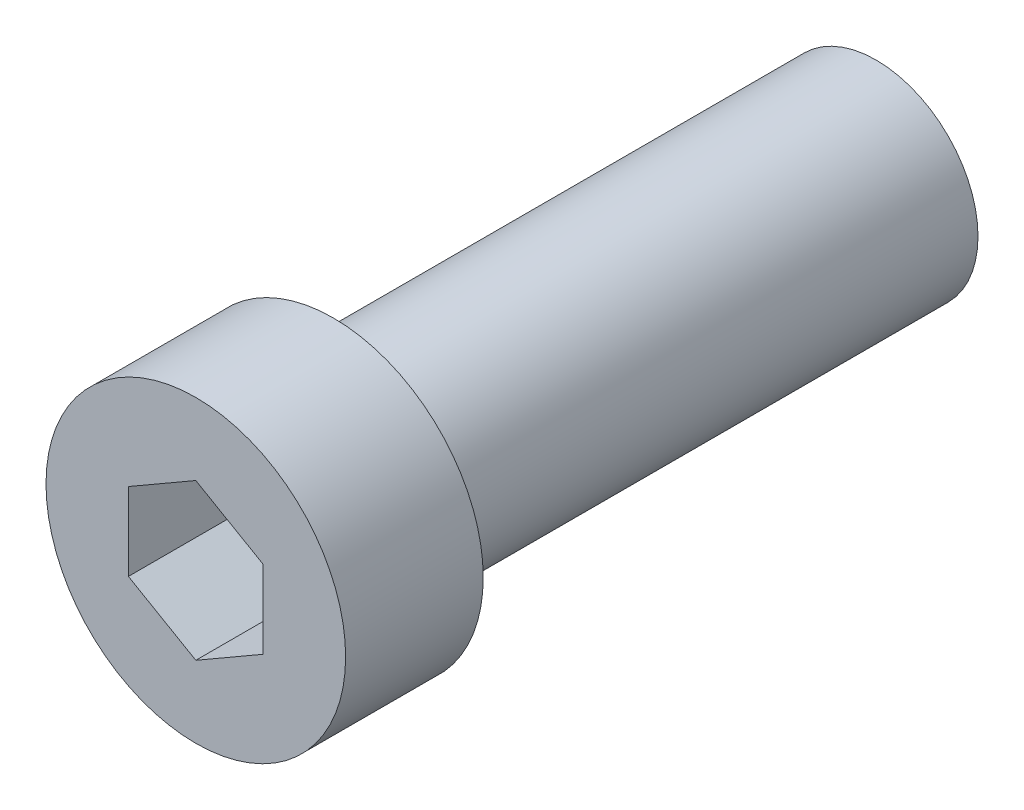
ISO-10303-21;
HEADER;
FILE_DESCRIPTION(('STEP AP214'),'2;1');
FILE_NAME('part.step','',(''),(''),'','','');
FILE_SCHEMA(('AUTOMOTIVE_DESIGN { 1 0 10303 214 1 1 1 1 }'));
ENDSEC;
DATA;
#1=APPLICATION_CONTEXT('core data for automotive mechanical design processes');
#2=APPLICATION_PROTOCOL_DEFINITION('international standard','automotive_design',2000,#1);
#3=PRODUCT_CONTEXT('',#1,'mechanical');
#4=PRODUCT('Part','Part','',(#3));
#5=PRODUCT_RELATED_PRODUCT_CATEGORY('part','',(#4));
#6=PRODUCT_DEFINITION_FORMATION('','',#4);
#7=PRODUCT_DEFINITION_CONTEXT('part definition',#1,'design');
#8=PRODUCT_DEFINITION('design','',#6,#7);
#9=PRODUCT_DEFINITION_SHAPE('','',#8);
#10=(LENGTH_UNIT() NAMED_UNIT(*) SI_UNIT(.MILLI.,.METRE.));
#11=(NAMED_UNIT(*) PLANE_ANGLE_UNIT() SI_UNIT($,.RADIAN.));
#12=(NAMED_UNIT(*) SI_UNIT($,.STERADIAN.) SOLID_ANGLE_UNIT());
#13=UNCERTAINTY_MEASURE_WITH_UNIT(LENGTH_MEASURE(1.E-05),#10,'distance_accuracy_value','');
#14=(GEOMETRIC_REPRESENTATION_CONTEXT(3) GLOBAL_UNCERTAINTY_ASSIGNED_CONTEXT((#13)) GLOBAL_UNIT_ASSIGNED_CONTEXT((#10,
#11,#12)) REPRESENTATION_CONTEXT('',''));
#15=CARTESIAN_POINT('',(0.,0.,0.));
#16=DIRECTION('',(0.,0.,1.));
#17=DIRECTION('',(1.,0.,0.));
#18=AXIS2_PLACEMENT_3D('',#15,#16,#17);
#19=CARTESIAN_POINT('',(0.,0.,2.028));
#20=DIRECTION('',(0.,0.,-1.));
#21=DIRECTION('',(0.,1.,0.));
#22=AXIS2_PLACEMENT_3D('',#19,#20,#21);
#23=CYLINDRICAL_SURFACE('',#22,2.208);
#24=CARTESIAN_POINT('',(0.,0.,2.028));
#25=DIRECTION('',(0.,0.,-1.));
#26=DIRECTION('',(0.,1.,0.));
#27=AXIS2_PLACEMENT_3D('',#24,#25,#26);
#28=CIRCLE('',#27,2.208);
#29=CARTESIAN_POINT('',(0.,2.208,2.028));
#30=VERTEX_POINT('',#29);
#31=EDGE_CURVE('E39',#30,#30,#28,.T.);
#32=ORIENTED_EDGE('',*,*,#31,.T.);
#33=EDGE_LOOP('',(#32));
#34=FACE_BOUND('',#33,.T.);
#35=CARTESIAN_POINT('',(0.,0.,0.));
#36=DIRECTION('',(0.,0.,-1.));
#37=DIRECTION('',(0.,1.,0.));
#38=AXIS2_PLACEMENT_3D('',#35,#36,#37);
#39=CIRCLE('',#38,2.208);
#40=CARTESIAN_POINT('',(0.,2.208,0.));
#41=VERTEX_POINT('',#40);
#42=EDGE_CURVE('E145',#41,#41,#39,.T.);
#43=ORIENTED_EDGE('',*,*,#42,.F.);
#44=EDGE_LOOP('',(#43));
#45=FACE_BOUND('',#44,.T.);
#46=ADVANCED_FACE('F36',(#34,#45),#23,.T.);
#47=CARTESIAN_POINT('',(2.208,0.,2.028));
#48=DIRECTION('',(0.,0.,1.));
#49=DIRECTION('',(0.,-1.,0.));
#50=AXIS2_PLACEMENT_3D('',#47,#48,#49);
#51=PLANE('',#50);
#52=DIRECTION('',(0.866025403784439,0.5,0.));
#53=VECTOR('',#52,1.);
#54=CARTESIAN_POINT('',(0.,-1.14731045493362,2.028));
#55=LINE('',#54,#53);
#56=CARTESIAN_POINT('',(0.,-1.14731045493362,2.028));
#57=VERTEX_POINT('',#56);
#58=CARTESIAN_POINT('',(0.9936,-0.573655227466812,2.028));
#59=VERTEX_POINT('',#58);
#60=EDGE_CURVE('E51',#57,#59,#55,.T.);
#61=ORIENTED_EDGE('',*,*,#60,.F.);
#62=DIRECTION('',(0.866025403784439,-0.5,0.));
#63=VECTOR('',#62,1.);
#64=CARTESIAN_POINT('',(-0.9936,-0.573655227466812,2.028));
#65=LINE('',#64,#63);
#66=CARTESIAN_POINT('',(-0.9936,-0.573655227466812,2.028));
#67=VERTEX_POINT('',#66);
#68=EDGE_CURVE('E134',#67,#57,#65,.T.);
#69=ORIENTED_EDGE('',*,*,#68,.F.);
#70=DIRECTION('',(0.,-1.,0.));
#71=VECTOR('',#70,1.);
#72=CARTESIAN_POINT('',(-0.9936,0.573655227466811,2.028));
#73=LINE('',#72,#71);
#74=CARTESIAN_POINT('',(-0.9936,0.573655227466811,2.028));
#75=VERTEX_POINT('',#74);
#76=EDGE_CURVE('E132',#75,#67,#73,.T.);
#77=ORIENTED_EDGE('',*,*,#76,.F.);
#78=DIRECTION('',(-0.866025403784438,-0.500000000000001,0.));
#79=VECTOR('',#78,1.);
#80=CARTESIAN_POINT('',(0.,1.14731045493362,2.028));
#81=LINE('',#80,#79);
#82=CARTESIAN_POINT('',(0.,1.14731045493362,2.028));
#83=VERTEX_POINT('',#82);
#84=EDGE_CURVE('E99',#83,#75,#81,.T.);
#85=ORIENTED_EDGE('',*,*,#84,.F.);
#86=DIRECTION('',(-0.866025403784438,0.500000000000001,0.));
#87=VECTOR('',#86,1.);
#88=CARTESIAN_POINT('',(0.9936,0.573655227466811,2.028));
#89=LINE('',#88,#87);
#90=CARTESIAN_POINT('',(0.9936,0.573655227466811,2.028));
#91=VERTEX_POINT('',#90);
#92=EDGE_CURVE('E128',#91,#83,#89,.T.);
#93=ORIENTED_EDGE('',*,*,#92,.F.);
#94=DIRECTION('',(0.,1.,0.));
#95=VECTOR('',#94,1.);
#96=CARTESIAN_POINT('',(0.9936,-0.573655227466812,2.028));
#97=LINE('',#96,#95);
#98=EDGE_CURVE('E125',#59,#91,#97,.T.);
#99=ORIENTED_EDGE('',*,*,#98,.F.);
#100=EDGE_LOOP('',(#61,#69,#77,#85,#93,#99));
#101=FACE_BOUND('',#100,.T.);
#102=ORIENTED_EDGE('',*,*,#31,.F.);
#103=EDGE_LOOP('',(#102));
#104=FACE_BOUND('',#103,.T.);
#105=ADVANCED_FACE('F154',(#101,#104),#51,.T.);
#106=CARTESIAN_POINT('',(0.,0.,0.));
#107=DIRECTION('',(0.,0.,-1.));
#108=DIRECTION('',(0.,1.,0.));
#109=AXIS2_PLACEMENT_3D('',#106,#107,#108);
#110=PLANE('',#109);
#111=CARTESIAN_POINT('',(0.,0.,0.));
#112=DIRECTION('',(0.,0.,-1.));
#113=DIRECTION('',(0.,1.,0.));
#114=AXIS2_PLACEMENT_3D('',#111,#112,#113);
#115=CIRCLE('',#114,1.50000000000006);
#116=CARTESIAN_POINT('',(0.,1.50000000000006,0.));
#117=VERTEX_POINT('',#116);
#118=EDGE_CURVE('E11',#117,#117,#115,.T.);
#119=ORIENTED_EDGE('',*,*,#118,.F.);
#120=EDGE_LOOP('',(#119));
#121=FACE_BOUND('',#120,.T.);
#122=ORIENTED_EDGE('',*,*,#42,.T.);
#123=EDGE_LOOP('',(#122));
#124=FACE_BOUND('',#123,.T.);
#125=ADVANCED_FACE('F156',(#121,#124),#110,.T.);
#126=CARTESIAN_POINT('',(0.,0.,-8.));
#127=DIRECTION('',(0.,0.,1.));
#128=DIRECTION('',(0.,-1.,0.));
#129=AXIS2_PLACEMENT_3D('',#126,#127,#128);
#130=CYLINDRICAL_SURFACE('',#129,1.50000000000006);
#131=CARTESIAN_POINT('',(0.,0.,-8.));
#132=DIRECTION('',(0.,0.,-1.));
#133=DIRECTION('',(0.,1.,0.));
#134=AXIS2_PLACEMENT_3D('',#131,#132,#133);
#135=CIRCLE('',#134,1.50000000000006);
#136=CARTESIAN_POINT('',(0.,1.50000000000005,-8.));
#137=VERTEX_POINT('',#136);
#138=EDGE_CURVE('E138',#137,#137,#135,.T.);
#139=ORIENTED_EDGE('',*,*,#138,.F.);
#140=EDGE_LOOP('',(#139));
#141=FACE_BOUND('',#140,.T.);
#142=ORIENTED_EDGE('',*,*,#118,.T.);
#143=EDGE_LOOP('',(#142));
#144=FACE_BOUND('',#143,.T.);
#145=ADVANCED_FACE('F162',(#141,#144),#130,.T.);
#146=CARTESIAN_POINT('',(0.,0.,-8.));
#147=DIRECTION('',(0.,0.,-1.));
#148=DIRECTION('',(0.,1.,0.));
#149=AXIS2_PLACEMENT_3D('',#146,#147,#148);
#150=PLANE('',#149);
#151=ORIENTED_EDGE('',*,*,#138,.T.);
#152=EDGE_LOOP('',(#151));
#153=FACE_BOUND('',#152,.T.);
#154=ADVANCED_FACE('F168',(#153),#150,.T.);
#155=CARTESIAN_POINT('',(0.,-1.14731045493362,0.156));
#156=DIRECTION('',(0.5,-0.866025403784439,0.));
#157=DIRECTION('',(0.866025403784439,0.5,0.));
#158=AXIS2_PLACEMENT_3D('',#155,#156,#157);
#159=PLANE('',#158);
#160=ORIENTED_EDGE('',*,*,#60,.T.);
#161=DIRECTION('',(0.,0.,1.));
#162=VECTOR('',#161,1.);
#163=CARTESIAN_POINT('',(0.9936,-0.573655227466812,0.156));
#164=LINE('',#163,#162);
#165=CARTESIAN_POINT('',(0.9936,-0.573655227466812,0.156));
#166=VERTEX_POINT('',#165);
#167=EDGE_CURVE('E81',#166,#59,#164,.T.);
#168=ORIENTED_EDGE('',*,*,#167,.F.);
#169=DIRECTION('',(0.866025403784439,0.5,0.));
#170=VECTOR('',#169,1.);
#171=CARTESIAN_POINT('',(0.,-1.14731045493362,0.156));
#172=LINE('',#171,#170);
#173=CARTESIAN_POINT('',(0.,-1.14731045493362,0.156));
#174=VERTEX_POINT('',#173);
#175=EDGE_CURVE('E136',#174,#166,#172,.T.);
#176=ORIENTED_EDGE('',*,*,#175,.F.);
#177=DIRECTION('',(0.,0.,1.));
#178=VECTOR('',#177,1.);
#179=CARTESIAN_POINT('',(0.,-1.14731045493362,0.156));
#180=LINE('',#179,#178);
#181=EDGE_CURVE('E59',#174,#57,#180,.T.);
#182=ORIENTED_EDGE('',*,*,#181,.T.);
#183=EDGE_LOOP('',(#160,#168,#176,#182));
#184=FACE_BOUND('',#183,.T.);
#185=ADVANCED_FACE('F172',(#184),#159,.F.);
#186=CARTESIAN_POINT('',(-0.9936,-0.573655227466812,0.156));
#187=DIRECTION('',(-0.5,-0.866025403784439,0.));
#188=DIRECTION('',(0.866025403784439,-0.5,0.));
#189=AXIS2_PLACEMENT_3D('',#186,#187,#188);
#190=PLANE('',#189);
#191=ORIENTED_EDGE('',*,*,#68,.T.);
#192=ORIENTED_EDGE('',*,*,#181,.F.);
#193=DIRECTION('',(0.866025403784439,-0.5,0.));
#194=VECTOR('',#193,1.);
#195=CARTESIAN_POINT('',(-0.9936,-0.573655227466812,0.156));
#196=LINE('',#195,#194);
#197=CARTESIAN_POINT('',(-0.9936,-0.573655227466812,0.156));
#198=VERTEX_POINT('',#197);
#199=EDGE_CURVE('E111',#198,#174,#196,.T.);
#200=ORIENTED_EDGE('',*,*,#199,.F.);
#201=DIRECTION('',(0.,0.,1.));
#202=VECTOR('',#201,1.);
#203=CARTESIAN_POINT('',(-0.9936,-0.573655227466812,0.156));
#204=LINE('',#203,#202);
#205=EDGE_CURVE('E103',#198,#67,#204,.T.);
#206=ORIENTED_EDGE('',*,*,#205,.T.);
#207=EDGE_LOOP('',(#191,#192,#200,#206));
#208=FACE_BOUND('',#207,.T.);
#209=ADVANCED_FACE('F176',(#208),#190,.F.);
#210=CARTESIAN_POINT('',(-0.9936,0.573655227466811,0.156));
#211=DIRECTION('',(-1.,0.,0.));
#212=DIRECTION('',(0.,0.,1.));
#213=AXIS2_PLACEMENT_3D('',#210,#211,#212);
#214=PLANE('',#213);
#215=ORIENTED_EDGE('',*,*,#76,.T.);
#216=ORIENTED_EDGE('',*,*,#205,.F.);
#217=DIRECTION('',(0.,-1.,0.));
#218=VECTOR('',#217,1.);
#219=CARTESIAN_POINT('',(-0.9936,0.573655227466811,0.156));
#220=LINE('',#219,#218);
#221=CARTESIAN_POINT('',(-0.9936,0.573655227466811,0.156));
#222=VERTEX_POINT('',#221);
#223=EDGE_CURVE('E107',#222,#198,#220,.T.);
#224=ORIENTED_EDGE('',*,*,#223,.F.);
#225=DIRECTION('',(0.,0.,1.));
#226=VECTOR('',#225,1.);
#227=CARTESIAN_POINT('',(-0.9936,0.573655227466811,0.156));
#228=LINE('',#227,#226);
#229=EDGE_CURVE('E92',#222,#75,#228,.T.);
#230=ORIENTED_EDGE('',*,*,#229,.T.);
#231=EDGE_LOOP('',(#215,#216,#224,#230));
#232=FACE_BOUND('',#231,.T.);
#233=ADVANCED_FACE('F108',(#232),#214,.F.);
#234=CARTESIAN_POINT('',(0.,1.14731045493362,0.156));
#235=DIRECTION('',(-0.500000000000001,0.866025403784438,0.));
#236=DIRECTION('',(-0.866025403784438,-0.500000000000001,0.));
#237=AXIS2_PLACEMENT_3D('',#234,#235,#236);
#238=PLANE('',#237);
#239=ORIENTED_EDGE('',*,*,#84,.T.);
#240=ORIENTED_EDGE('',*,*,#229,.F.);
#241=DIRECTION('',(-0.866025403784438,-0.500000000000001,0.));
#242=VECTOR('',#241,1.);
#243=CARTESIAN_POINT('',(0.,1.14731045493362,0.156));
#244=LINE('',#243,#242);
#245=CARTESIAN_POINT('',(0.,1.14731045493362,0.156));
#246=VERTEX_POINT('',#245);
#247=EDGE_CURVE('E96',#246,#222,#244,.T.);
#248=ORIENTED_EDGE('',*,*,#247,.F.);
#249=DIRECTION('',(0.,0.,1.));
#250=VECTOR('',#249,1.);
#251=CARTESIAN_POINT('',(0.,1.14731045493362,0.156));
#252=LINE('',#251,#250);
#253=EDGE_CURVE('E104',#246,#83,#252,.T.);
#254=ORIENTED_EDGE('',*,*,#253,.T.);
#255=EDGE_LOOP('',(#239,#240,#248,#254));
#256=FACE_BOUND('',#255,.T.);
#257=ADVANCED_FACE('F94',(#256),#238,.F.);
#258=CARTESIAN_POINT('',(0.9936,0.573655227466811,0.156));
#259=DIRECTION('',(0.500000000000001,0.866025403784438,0.));
#260=DIRECTION('',(-0.866025403784438,0.500000000000001,0.));
#261=AXIS2_PLACEMENT_3D('',#258,#259,#260);
#262=PLANE('',#261);
#263=ORIENTED_EDGE('',*,*,#92,.T.);
#264=ORIENTED_EDGE('',*,*,#253,.F.);
#265=DIRECTION('',(-0.866025403784438,0.500000000000001,0.));
#266=VECTOR('',#265,1.);
#267=CARTESIAN_POINT('',(0.9936,0.573655227466811,0.156));
#268=LINE('',#267,#266);
#269=CARTESIAN_POINT('',(0.9936,0.573655227466811,0.156));
#270=VERTEX_POINT('',#269);
#271=EDGE_CURVE('E117',#270,#246,#268,.T.);
#272=ORIENTED_EDGE('',*,*,#271,.F.);
#273=DIRECTION('',(0.,0.,1.));
#274=VECTOR('',#273,1.);
#275=CARTESIAN_POINT('',(0.9936,0.573655227466811,0.156));
#276=LINE('',#275,#274);
#277=EDGE_CURVE('E141',#270,#91,#276,.T.);
#278=ORIENTED_EDGE('',*,*,#277,.T.);
#279=EDGE_LOOP('',(#263,#264,#272,#278));
#280=FACE_BOUND('',#279,.T.);
#281=ADVANCED_FACE('F180',(#280),#262,.F.);
#282=CARTESIAN_POINT('',(0.9936,-0.573655227466812,0.156));
#283=DIRECTION('',(1.,0.,0.));
#284=DIRECTION('',(0.,0.,-1.));
#285=AXIS2_PLACEMENT_3D('',#282,#283,#284);
#286=PLANE('',#285);
#287=ORIENTED_EDGE('',*,*,#98,.T.);
#288=ORIENTED_EDGE('',*,*,#277,.F.);
#289=DIRECTION('',(0.,1.,0.));
#290=VECTOR('',#289,1.);
#291=CARTESIAN_POINT('',(0.9936,-0.573655227466812,0.156));
#292=LINE('',#291,#290);
#293=EDGE_CURVE('E119',#166,#270,#292,.T.);
#294=ORIENTED_EDGE('',*,*,#293,.F.);
#295=ORIENTED_EDGE('',*,*,#167,.T.);
#296=EDGE_LOOP('',(#287,#288,#294,#295));
#297=FACE_BOUND('',#296,.T.);
#298=ADVANCED_FACE('F177',(#297),#286,.F.);
#299=CARTESIAN_POINT('',(0.,0.,0.156));
#300=DIRECTION('',(0.,0.,1.));
#301=DIRECTION('',(1.,0.,0.));
#302=AXIS2_PLACEMENT_3D('',#299,#300,#301);
#303=PLANE('',#302);
#304=ORIENTED_EDGE('',*,*,#175,.T.);
#305=ORIENTED_EDGE('',*,*,#293,.T.);
#306=ORIENTED_EDGE('',*,*,#271,.T.);
#307=ORIENTED_EDGE('',*,*,#247,.T.);
#308=ORIENTED_EDGE('',*,*,#223,.T.);
#309=ORIENTED_EDGE('',*,*,#199,.T.);
#310=EDGE_LOOP('',(#304,#305,#306,#307,#308,#309));
#311=FACE_BOUND('',#310,.T.);
#312=ADVANCED_FACE('F114',(#311),#303,.T.);
#313=CLOSED_SHELL('',(#46,#105,#125,#145,#154,#185,#209,#233,#257,#281,#298,#312));
#314=MANIFOLD_SOLID_BREP('B2',#313);
#315=ADVANCED_BREP_SHAPE_REPRESENTATION('',(#18,#314),#14);
#316=SHAPE_DEFINITION_REPRESENTATION(#9,#315);
ENDSEC;
END-ISO-10303-21;
